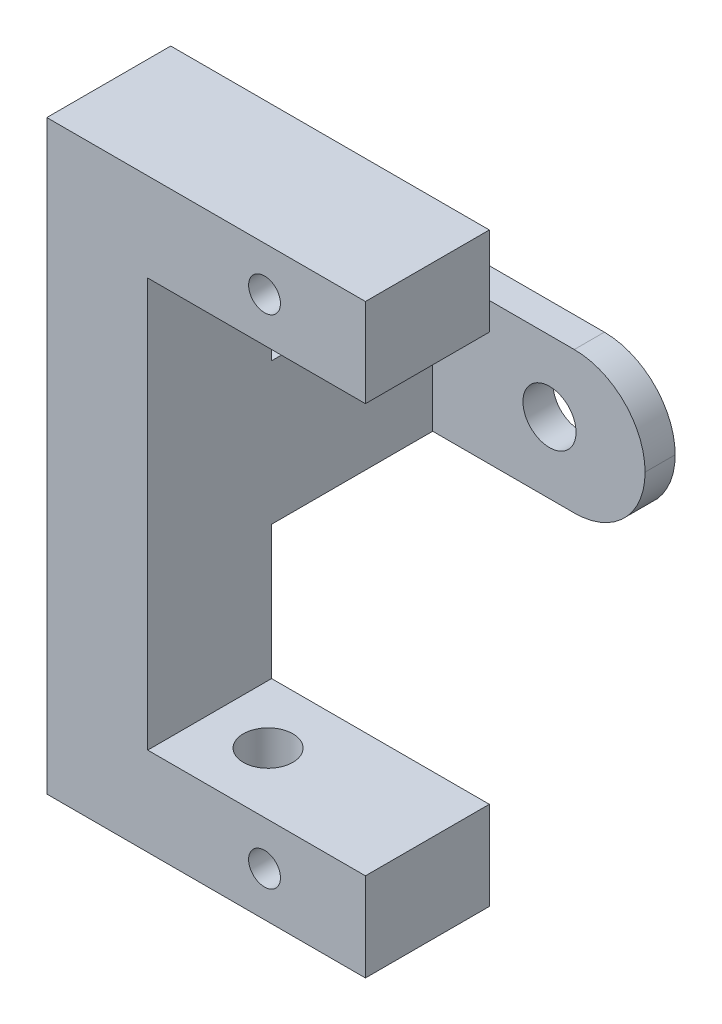
ISO-10303-21;
HEADER;
FILE_DESCRIPTION(('STEP AP214'),'2;1');
FILE_NAME('part.step','',(''),(''),'','','');
FILE_SCHEMA(('AUTOMOTIVE_DESIGN { 1 0 10303 214 1 1 1 1 }'));
ENDSEC;
DATA;
#1=APPLICATION_CONTEXT('core data for automotive mechanical design processes');
#2=APPLICATION_PROTOCOL_DEFINITION('international standard','automotive_design',2000,#1);
#3=PRODUCT_CONTEXT('',#1,'mechanical');
#4=PRODUCT('Part','Part','',(#3));
#5=PRODUCT_RELATED_PRODUCT_CATEGORY('part','',(#4));
#6=PRODUCT_DEFINITION_FORMATION('','',#4);
#7=PRODUCT_DEFINITION_CONTEXT('part definition',#1,'design');
#8=PRODUCT_DEFINITION('design','',#6,#7);
#9=PRODUCT_DEFINITION_SHAPE('','',#8);
#10=(LENGTH_UNIT() NAMED_UNIT(*) SI_UNIT(.MILLI.,.METRE.));
#11=(NAMED_UNIT(*) PLANE_ANGLE_UNIT() SI_UNIT($,.RADIAN.));
#12=(NAMED_UNIT(*) SI_UNIT($,.STERADIAN.) SOLID_ANGLE_UNIT());
#13=UNCERTAINTY_MEASURE_WITH_UNIT(LENGTH_MEASURE(1.E-05),#10,'distance_accuracy_value','');
#14=(GEOMETRIC_REPRESENTATION_CONTEXT(3) GLOBAL_UNCERTAINTY_ASSIGNED_CONTEXT((#13)) GLOBAL_UNIT_ASSIGNED_CONTEXT((#10,
#11,#12)) REPRESENTATION_CONTEXT('',''));
#15=CARTESIAN_POINT('',(0.,0.,0.));
#16=DIRECTION('',(0.,0.,1.));
#17=DIRECTION('',(1.,0.,0.));
#18=AXIS2_PLACEMENT_3D('',#15,#16,#17);
#19=CARTESIAN_POINT('',(-4.,11.55,7.));
#20=DIRECTION('',(-1.,0.,0.));
#21=DIRECTION('',(0.,0.,1.));
#22=AXIS2_PLACEMENT_3D('',#19,#20,#21);
#23=PLANE('',#22);
#24=DIRECTION('',(0.,-1.,0.));
#25=VECTOR('',#24,1.);
#26=CARTESIAN_POINT('',(-4.,4.,-9.1));
#27=LINE('',#26,#25);
#28=CARTESIAN_POINT('',(-4.,4.,-9.1));
#29=VERTEX_POINT('',#28);
#30=CARTESIAN_POINT('',(-4.,-4.,-9.1));
#31=VERTEX_POINT('',#30);
#32=EDGE_CURVE('E143',#29,#31,#27,.T.);
#33=ORIENTED_EDGE('',*,*,#32,.F.);
#34=DIRECTION('',(0.,0.,1.));
#35=VECTOR('',#34,1.);
#36=CARTESIAN_POINT('',(-4.,4.,-10.8));
#37=LINE('',#36,#35);
#38=CARTESIAN_POINT('',(-4.,4.,0.));
#39=VERTEX_POINT('',#38);
#40=EDGE_CURVE('E155',#29,#39,#37,.T.);
#41=ORIENTED_EDGE('',*,*,#40,.T.);
#42=DIRECTION('',(0.,1.,0.));
#43=VECTOR('',#42,1.);
#44=CARTESIAN_POINT('',(-4.,11.55,0.));
#45=LINE('',#44,#43);
#46=CARTESIAN_POINT('',(-4.,11.55,0.));
#47=VERTEX_POINT('',#46);
#48=EDGE_CURVE('E229',#39,#47,#45,.T.);
#49=ORIENTED_EDGE('',*,*,#48,.T.);
#50=DIRECTION('',(0.,0.,-1.));
#51=VECTOR('',#50,1.);
#52=CARTESIAN_POINT('',(-4.,11.55,7.));
#53=LINE('',#52,#51);
#54=CARTESIAN_POINT('',(-4.,11.55,7.));
#55=VERTEX_POINT('',#54);
#56=EDGE_CURVE('E235',#55,#47,#53,.T.);
#57=ORIENTED_EDGE('',*,*,#56,.F.);
#58=DIRECTION('',(0.,1.,0.));
#59=VECTOR('',#58,1.);
#60=CARTESIAN_POINT('',(-4.,11.55,7.));
#61=LINE('',#60,#59);
#62=CARTESIAN_POINT('',(-4.,-11.55,7.));
#63=VERTEX_POINT('',#62);
#64=EDGE_CURVE('E210',#63,#55,#61,.T.);
#65=ORIENTED_EDGE('',*,*,#64,.F.);
#66=DIRECTION('',(0.,0.,-1.));
#67=VECTOR('',#66,1.);
#68=CARTESIAN_POINT('',(-4.,-11.55,7.));
#69=LINE('',#68,#67);
#70=CARTESIAN_POINT('',(-4.,-11.55,0.));
#71=VERTEX_POINT('',#70);
#72=EDGE_CURVE('E238',#63,#71,#69,.T.);
#73=ORIENTED_EDGE('',*,*,#72,.T.);
#74=CARTESIAN_POINT('',(-4.,-4.,0.));
#75=VERTEX_POINT('',#74);
#76=EDGE_CURVE('E230',#71,#75,#45,.T.);
#77=ORIENTED_EDGE('',*,*,#76,.T.);
#78=DIRECTION('',(0.,0.,1.));
#79=VECTOR('',#78,1.);
#80=CARTESIAN_POINT('',(-4.,-4.,-10.8));
#81=LINE('',#80,#79);
#82=EDGE_CURVE('E158',#31,#75,#81,.T.);
#83=ORIENTED_EDGE('',*,*,#82,.F.);
#84=EDGE_LOOP('',(#33,#41,#49,#57,#65,#73,#77,#83));
#85=FACE_BOUND('',#84,.T.);
#86=ADVANCED_FACE('F35',(#85),#23,.F.);
#87=CARTESIAN_POINT('',(0.,0.,0.));
#88=DIRECTION('',(0.,0.,-1.));
#89=DIRECTION('',(-1.,0.,0.));
#90=AXIS2_PLACEMENT_3D('',#87,#88,#89);
#91=PLANE('',#90);
#92=DIRECTION('',(1.,0.,0.));
#93=VECTOR('',#92,1.);
#94=CARTESIAN_POINT('',(-4.,4.,0.));
#95=LINE('',#94,#93);
#96=CARTESIAN_POINT('',(-9.69999999999999,4.,0.));
#97=VERTEX_POINT('',#96);
#98=EDGE_CURVE('E163',#97,#39,#95,.T.);
#99=ORIENTED_EDGE('',*,*,#98,.F.);
#100=DIRECTION('',(0.,-1.,0.));
#101=VECTOR('',#100,1.);
#102=CARTESIAN_POINT('',(-9.69999999999999,-16.55,0.));
#103=LINE('',#102,#101);
#104=CARTESIAN_POINT('',(-9.69999999999999,16.55,0.));
#105=VERTEX_POINT('',#104);
#106=EDGE_CURVE('E220',#105,#97,#103,.T.);
#107=ORIENTED_EDGE('',*,*,#106,.F.);
#108=DIRECTION('',(-1.,0.,0.));
#109=VECTOR('',#108,1.);
#110=CARTESIAN_POINT('',(-9.69999999999999,16.55,0.));
#111=LINE('',#110,#109);
#112=CARTESIAN_POINT('',(8.30000000000001,16.55,0.));
#113=VERTEX_POINT('',#112);
#114=EDGE_CURVE('E217',#113,#105,#111,.T.);
#115=ORIENTED_EDGE('',*,*,#114,.F.);
#116=DIRECTION('',(0.,1.,0.));
#117=VECTOR('',#116,1.);
#118=CARTESIAN_POINT('',(8.30000000000001,16.55,0.));
#119=LINE('',#118,#117);
#120=CARTESIAN_POINT('',(8.3,11.55,0.));
#121=VERTEX_POINT('',#120);
#122=EDGE_CURVE('E187',#121,#113,#119,.T.);
#123=ORIENTED_EDGE('',*,*,#122,.F.);
#124=DIRECTION('',(1.,0.,0.));
#125=VECTOR('',#124,1.);
#126=CARTESIAN_POINT('',(8.3,11.55,0.));
#127=LINE('',#126,#125);
#128=EDGE_CURVE('E200',#47,#121,#127,.T.);
#129=ORIENTED_EDGE('',*,*,#128,.F.);
#130=ORIENTED_EDGE('',*,*,#48,.F.);
#131=EDGE_LOOP('',(#99,#107,#115,#123,#129,#130));
#132=FACE_BOUND('',#131,.T.);
#133=CARTESIAN_POINT('',(2.6,14.05,0.));
#134=DIRECTION('',(0.,0.,1.));
#135=DIRECTION('',(1.,0.,0.));
#136=AXIS2_PLACEMENT_3D('',#133,#134,#135);
#137=CIRCLE('',#136,0.9);
#138=CARTESIAN_POINT('',(3.5,14.05,0.));
#139=VERTEX_POINT('',#138);
#140=EDGE_CURVE('E184',#139,#139,#137,.T.);
#141=ORIENTED_EDGE('',*,*,#140,.T.);
#142=EDGE_LOOP('',(#141));
#143=FACE_BOUND('',#142,.T.);
#144=ADVANCED_FACE('F276',(#132,#143),#91,.T.);
#145=CARTESIAN_POINT('',(8.30000000000001,16.55,7.));
#146=DIRECTION('',(-1.,0.,0.));
#147=DIRECTION('',(0.,-1.,0.));
#148=AXIS2_PLACEMENT_3D('',#145,#146,#147);
#149=PLANE('',#148);
#150=ORIENTED_EDGE('',*,*,#122,.T.);
#151=DIRECTION('',(0.,0.,-1.));
#152=VECTOR('',#151,1.);
#153=CARTESIAN_POINT('',(8.30000000000001,16.55,7.));
#154=LINE('',#153,#152);
#155=CARTESIAN_POINT('',(8.30000000000001,16.55,7.));
#156=VERTEX_POINT('',#155);
#157=EDGE_CURVE('E253',#156,#113,#154,.T.);
#158=ORIENTED_EDGE('',*,*,#157,.F.);
#159=DIRECTION('',(0.,1.,0.));
#160=VECTOR('',#159,1.);
#161=CARTESIAN_POINT('',(8.30000000000001,16.55,7.));
#162=LINE('',#161,#160);
#163=CARTESIAN_POINT('',(8.3,11.55,7.));
#164=VERTEX_POINT('',#163);
#165=EDGE_CURVE('E196',#164,#156,#162,.T.);
#166=ORIENTED_EDGE('',*,*,#165,.F.);
#167=DIRECTION('',(0.,0.,-1.));
#168=VECTOR('',#167,1.);
#169=CARTESIAN_POINT('',(8.3,11.55,7.));
#170=LINE('',#169,#168);
#171=EDGE_CURVE('E214',#164,#121,#170,.T.);
#172=ORIENTED_EDGE('',*,*,#171,.T.);
#173=EDGE_LOOP('',(#150,#158,#166,#172));
#174=FACE_BOUND('',#173,.T.);
#175=ADVANCED_FACE('F311',(#174),#149,.F.);
#176=CARTESIAN_POINT('',(-9.69999999999999,16.55,7.));
#177=DIRECTION('',(0.,-1.,0.));
#178=DIRECTION('',(0.,0.,-1.));
#179=AXIS2_PLACEMENT_3D('',#176,#177,#178);
#180=PLANE('',#179);
#181=ORIENTED_EDGE('',*,*,#114,.T.);
#182=DIRECTION('',(0.,0.,-1.));
#183=VECTOR('',#182,1.);
#184=CARTESIAN_POINT('',(-9.69999999999999,16.55,7.));
#185=LINE('',#184,#183);
#186=CARTESIAN_POINT('',(-9.69999999999999,16.55,7.));
#187=VERTEX_POINT('',#186);
#188=EDGE_CURVE('E250',#187,#105,#185,.T.);
#189=ORIENTED_EDGE('',*,*,#188,.F.);
#190=DIRECTION('',(-1.,0.,0.));
#191=VECTOR('',#190,1.);
#192=CARTESIAN_POINT('',(-9.69999999999999,16.55,7.));
#193=LINE('',#192,#191);
#194=EDGE_CURVE('E199',#156,#187,#193,.T.);
#195=ORIENTED_EDGE('',*,*,#194,.F.);
#196=ORIENTED_EDGE('',*,*,#157,.T.);
#197=EDGE_LOOP('',(#181,#189,#195,#196));
#198=FACE_BOUND('',#197,.T.);
#199=ADVANCED_FACE('F331',(#198),#180,.F.);
#200=CARTESIAN_POINT('',(-9.69999999999999,-16.55,7.));
#201=DIRECTION('',(1.,0.,0.));
#202=DIRECTION('',(0.,0.,-1.));
#203=AXIS2_PLACEMENT_3D('',#200,#201,#202);
#204=PLANE('',#203);
#205=ORIENTED_EDGE('',*,*,#106,.T.);
#206=DIRECTION('',(0.,0.,1.));
#207=VECTOR('',#206,1.);
#208=CARTESIAN_POINT('',(-9.69999999999999,4.,-10.8));
#209=LINE('',#208,#207);
#210=CARTESIAN_POINT('',(-9.69999999999999,4.,-10.8));
#211=VERTEX_POINT('',#210);
#212=EDGE_CURVE('E164',#211,#97,#209,.T.);
#213=ORIENTED_EDGE('',*,*,#212,.F.);
#214=DIRECTION('',(0.,1.,0.));
#215=VECTOR('',#214,1.);
#216=CARTESIAN_POINT('',(-9.69999999999999,4.,-10.8));
#217=LINE('',#216,#215);
#218=CARTESIAN_POINT('',(-9.69999999999999,-4.,-10.8));
#219=VERTEX_POINT('',#218);
#220=EDGE_CURVE('E169',#219,#211,#217,.T.);
#221=ORIENTED_EDGE('',*,*,#220,.F.);
#222=DIRECTION('',(0.,0.,1.));
#223=VECTOR('',#222,1.);
#224=CARTESIAN_POINT('',(-9.69999999999999,-4.,-10.8));
#225=LINE('',#224,#223);
#226=CARTESIAN_POINT('',(-9.69999999999999,-4.,0.));
#227=VERTEX_POINT('',#226);
#228=EDGE_CURVE('E167',#219,#227,#225,.T.);
#229=ORIENTED_EDGE('',*,*,#228,.T.);
#230=CARTESIAN_POINT('',(-9.69999999999999,-16.55,0.));
#231=VERTEX_POINT('',#230);
#232=EDGE_CURVE('E219',#227,#231,#103,.T.);
#233=ORIENTED_EDGE('',*,*,#232,.T.);
#234=DIRECTION('',(0.,0.,-1.));
#235=VECTOR('',#234,1.);
#236=CARTESIAN_POINT('',(-9.69999999999999,-16.55,7.));
#237=LINE('',#236,#235);
#238=CARTESIAN_POINT('',(-9.69999999999999,-16.55,7.));
#239=VERTEX_POINT('',#238);
#240=EDGE_CURVE('E247',#239,#231,#237,.T.);
#241=ORIENTED_EDGE('',*,*,#240,.F.);
#242=DIRECTION('',(0.,-1.,0.));
#243=VECTOR('',#242,1.);
#244=CARTESIAN_POINT('',(-9.69999999999999,-16.55,7.));
#245=LINE('',#244,#243);
#246=EDGE_CURVE('E202',#187,#239,#245,.T.);
#247=ORIENTED_EDGE('',*,*,#246,.F.);
#248=ORIENTED_EDGE('',*,*,#188,.T.);
#249=EDGE_LOOP('',(#205,#213,#221,#229,#233,#241,#247,#248));
#250=FACE_BOUND('',#249,.T.);
#251=ADVANCED_FACE('F271',(#250),#204,.F.);
#252=CARTESIAN_POINT('',(8.30000000000001,-16.55,7.));
#253=DIRECTION('',(0.,1.,0.));
#254=DIRECTION('',(0.,0.,1.));
#255=AXIS2_PLACEMENT_3D('',#252,#253,#254);
#256=PLANE('',#255);
#257=CARTESIAN_POINT('',(-0.699999999999994,-16.55,3.5));
#258=DIRECTION('',(0.,-1.,0.));
#259=DIRECTION('',(0.,0.,-1.));
#260=AXIS2_PLACEMENT_3D('',#257,#258,#259);
#261=CIRCLE('',#260,1.4);
#262=CARTESIAN_POINT('',(-0.699999999999994,-16.55,2.1));
#263=VERTEX_POINT('',#262);
#264=EDGE_CURVE('E177',#263,#263,#261,.T.);
#265=ORIENTED_EDGE('',*,*,#264,.F.);
#266=EDGE_LOOP('',(#265));
#267=FACE_BOUND('',#266,.T.);
#268=DIRECTION('',(1.,0.,0.));
#269=VECTOR('',#268,1.);
#270=CARTESIAN_POINT('',(8.30000000000001,-16.55,0.));
#271=LINE('',#270,#269);
#272=CARTESIAN_POINT('',(8.30000000000001,-16.55,0.));
#273=VERTEX_POINT('',#272);
#274=EDGE_CURVE('E223',#231,#273,#271,.T.);
#275=ORIENTED_EDGE('',*,*,#274,.T.);
#276=DIRECTION('',(0.,0.,-1.));
#277=VECTOR('',#276,1.);
#278=CARTESIAN_POINT('',(8.30000000000001,-16.55,7.));
#279=LINE('',#278,#277);
#280=CARTESIAN_POINT('',(8.30000000000001,-16.55,7.));
#281=VERTEX_POINT('',#280);
#282=EDGE_CURVE('E244',#281,#273,#279,.T.);
#283=ORIENTED_EDGE('',*,*,#282,.F.);
#284=DIRECTION('',(1.,0.,0.));
#285=VECTOR('',#284,1.);
#286=CARTESIAN_POINT('',(8.30000000000001,-16.55,7.));
#287=LINE('',#286,#285);
#288=EDGE_CURVE('E204',#239,#281,#287,.T.);
#289=ORIENTED_EDGE('',*,*,#288,.F.);
#290=ORIENTED_EDGE('',*,*,#240,.T.);
#291=EDGE_LOOP('',(#275,#283,#289,#290));
#292=FACE_BOUND('',#291,.T.);
#293=ADVANCED_FACE('F324',(#267,#292),#256,.F.);
#294=CARTESIAN_POINT('',(8.3,-11.55,7.));
#295=DIRECTION('',(-1.,0.,0.));
#296=DIRECTION('',(0.,-1.,0.));
#297=AXIS2_PLACEMENT_3D('',#294,#295,#296);
#298=PLANE('',#297);
#299=DIRECTION('',(0.,1.,0.));
#300=VECTOR('',#299,1.);
#301=CARTESIAN_POINT('',(8.3,-11.55,0.));
#302=LINE('',#301,#300);
#303=CARTESIAN_POINT('',(8.3,-11.55,0.));
#304=VERTEX_POINT('',#303);
#305=EDGE_CURVE('E225',#273,#304,#302,.T.);
#306=ORIENTED_EDGE('',*,*,#305,.T.);
#307=DIRECTION('',(0.,0.,-1.));
#308=VECTOR('',#307,1.);
#309=CARTESIAN_POINT('',(8.3,-11.55,7.));
#310=LINE('',#309,#308);
#311=CARTESIAN_POINT('',(8.3,-11.55,7.));
#312=VERTEX_POINT('',#311);
#313=EDGE_CURVE('E241',#312,#304,#310,.T.);
#314=ORIENTED_EDGE('',*,*,#313,.F.);
#315=DIRECTION('',(0.,1.,0.));
#316=VECTOR('',#315,1.);
#317=CARTESIAN_POINT('',(8.3,-11.55,7.));
#318=LINE('',#317,#316);
#319=EDGE_CURVE('E206',#281,#312,#318,.T.);
#320=ORIENTED_EDGE('',*,*,#319,.F.);
#321=ORIENTED_EDGE('',*,*,#282,.T.);
#322=EDGE_LOOP('',(#306,#314,#320,#321));
#323=FACE_BOUND('',#322,.T.);
#324=ADVANCED_FACE('F320',(#323),#298,.F.);
#325=CARTESIAN_POINT('',(-4.,-11.55,7.));
#326=DIRECTION('',(0.,-1.,0.));
#327=DIRECTION('',(1.,0.,0.));
#328=AXIS2_PLACEMENT_3D('',#325,#326,#327);
#329=PLANE('',#328);
#330=CARTESIAN_POINT('',(-0.699999999999994,-11.55,3.5));
#331=DIRECTION('',(0.,-1.,0.));
#332=DIRECTION('',(1.,0.,0.));
#333=AXIS2_PLACEMENT_3D('',#330,#331,#332);
#334=CIRCLE('',#333,1.4);
#335=CARTESIAN_POINT('',(0.700000000000006,-11.55,3.5));
#336=VERTEX_POINT('',#335);
#337=EDGE_CURVE('E180',#336,#336,#334,.F.);
#338=ORIENTED_EDGE('',*,*,#337,.F.);
#339=EDGE_LOOP('',(#338));
#340=FACE_BOUND('',#339,.T.);
#341=DIRECTION('',(-1.,0.,0.));
#342=VECTOR('',#341,1.);
#343=CARTESIAN_POINT('',(-4.,-11.55,0.));
#344=LINE('',#343,#342);
#345=EDGE_CURVE('E227',#304,#71,#344,.T.);
#346=ORIENTED_EDGE('',*,*,#345,.T.);
#347=ORIENTED_EDGE('',*,*,#72,.F.);
#348=DIRECTION('',(-1.,0.,0.));
#349=VECTOR('',#348,1.);
#350=CARTESIAN_POINT('',(-4.,-11.55,7.));
#351=LINE('',#350,#349);
#352=EDGE_CURVE('E208',#312,#63,#351,.T.);
#353=ORIENTED_EDGE('',*,*,#352,.F.);
#354=ORIENTED_EDGE('',*,*,#313,.T.);
#355=EDGE_LOOP('',(#346,#347,#353,#354));
#356=FACE_BOUND('',#355,.T.);
#357=ADVANCED_FACE('F317',(#340,#356),#329,.F.);
#358=CARTESIAN_POINT('',(8.3,11.55,7.));
#359=DIRECTION('',(0.,1.,0.));
#360=DIRECTION('',(-1.,0.,0.));
#361=AXIS2_PLACEMENT_3D('',#358,#359,#360);
#362=PLANE('',#361);
#363=ORIENTED_EDGE('',*,*,#128,.T.);
#364=ORIENTED_EDGE('',*,*,#171,.F.);
#365=DIRECTION('',(1.,0.,0.));
#366=VECTOR('',#365,1.);
#367=CARTESIAN_POINT('',(8.3,11.55,7.));
#368=LINE('',#367,#366);
#369=EDGE_CURVE('E212',#55,#164,#368,.T.);
#370=ORIENTED_EDGE('',*,*,#369,.F.);
#371=ORIENTED_EDGE('',*,*,#56,.T.);
#372=EDGE_LOOP('',(#363,#364,#370,#371));
#373=FACE_BOUND('',#372,.T.);
#374=ADVANCED_FACE('F316',(#373),#362,.F.);
#375=CARTESIAN_POINT('',(0.,0.,7.));
#376=DIRECTION('',(0.,0.,-1.));
#377=DIRECTION('',(-1.,0.,0.));
#378=AXIS2_PLACEMENT_3D('',#375,#376,#377);
#379=PLANE('',#378);
#380=CARTESIAN_POINT('',(2.6,14.05,7.));
#381=DIRECTION('',(0.,0.,1.));
#382=DIRECTION('',(1.,0.,0.));
#383=AXIS2_PLACEMENT_3D('',#380,#381,#382);
#384=CIRCLE('',#383,0.9);
#385=CARTESIAN_POINT('',(3.5,14.05,7.));
#386=VERTEX_POINT('',#385);
#387=EDGE_CURVE('E188',#386,#386,#384,.T.);
#388=ORIENTED_EDGE('',*,*,#387,.F.);
#389=EDGE_LOOP('',(#388));
#390=FACE_BOUND('',#389,.T.);
#391=CARTESIAN_POINT('',(2.6,-14.05,7.));
#392=DIRECTION('',(0.,0.,1.));
#393=DIRECTION('',(-1.,0.,0.));
#394=AXIS2_PLACEMENT_3D('',#391,#392,#393);
#395=CIRCLE('',#394,0.9);
#396=CARTESIAN_POINT('',(1.7,-14.05,7.));
#397=VERTEX_POINT('',#396);
#398=EDGE_CURVE('E183',#397,#397,#395,.T.);
#399=ORIENTED_EDGE('',*,*,#398,.F.);
#400=EDGE_LOOP('',(#399));
#401=FACE_BOUND('',#400,.T.);
#402=ORIENTED_EDGE('',*,*,#165,.T.);
#403=ORIENTED_EDGE('',*,*,#194,.T.);
#404=ORIENTED_EDGE('',*,*,#246,.T.);
#405=ORIENTED_EDGE('',*,*,#288,.T.);
#406=ORIENTED_EDGE('',*,*,#319,.T.);
#407=ORIENTED_EDGE('',*,*,#352,.T.);
#408=ORIENTED_EDGE('',*,*,#64,.T.);
#409=ORIENTED_EDGE('',*,*,#369,.T.);
#410=EDGE_LOOP('',(#402,#403,#404,#405,#406,#407,#408,#409));
#411=FACE_BOUND('',#410,.T.);
#412=ADVANCED_FACE('F366',(#390,#401,#411),#379,.F.);
#413=DIRECTION('',(-1.,0.,0.));
#414=VECTOR('',#413,1.);
#415=CARTESIAN_POINT('',(-4.,-4.,0.));
#416=LINE('',#415,#414);
#417=EDGE_CURVE('E151',#75,#227,#416,.T.);
#418=ORIENTED_EDGE('',*,*,#417,.F.);
#419=ORIENTED_EDGE('',*,*,#76,.F.);
#420=ORIENTED_EDGE('',*,*,#345,.F.);
#421=ORIENTED_EDGE('',*,*,#305,.F.);
#422=ORIENTED_EDGE('',*,*,#274,.F.);
#423=ORIENTED_EDGE('',*,*,#232,.F.);
#424=EDGE_LOOP('',(#418,#419,#420,#421,#422,#423));
#425=FACE_BOUND('',#424,.T.);
#426=CARTESIAN_POINT('',(2.6,-14.05,0.));
#427=DIRECTION('',(0.,0.,1.));
#428=DIRECTION('',(-1.,0.,0.));
#429=AXIS2_PLACEMENT_3D('',#426,#427,#428);
#430=CIRCLE('',#429,0.9);
#431=CARTESIAN_POINT('',(1.7,-14.05,0.));
#432=VERTEX_POINT('',#431);
#433=EDGE_CURVE('E191',#432,#432,#430,.T.);
#434=ORIENTED_EDGE('',*,*,#433,.T.);
#435=EDGE_LOOP('',(#434));
#436=FACE_BOUND('',#435,.T.);
#437=ADVANCED_FACE('F313',(#425,#436),#91,.T.);
#438=CARTESIAN_POINT('',(2.6,-14.05,0.));
#439=DIRECTION('',(0.,0.,1.));
#440=DIRECTION('',(1.,0.,0.));
#441=AXIS2_PLACEMENT_3D('',#438,#439,#440);
#442=CYLINDRICAL_SURFACE('',#441,0.9);
#443=ORIENTED_EDGE('',*,*,#433,.F.);
#444=EDGE_LOOP('',(#443));
#445=FACE_BOUND('',#444,.T.);
#446=ORIENTED_EDGE('',*,*,#398,.T.);
#447=EDGE_LOOP('',(#446));
#448=FACE_BOUND('',#447,.T.);
#449=ADVANCED_FACE('F382',(#445,#448),#442,.F.);
#450=CARTESIAN_POINT('',(2.6,14.05,0.));
#451=DIRECTION('',(0.,0.,1.));
#452=DIRECTION('',(1.,0.,0.));
#453=AXIS2_PLACEMENT_3D('',#450,#451,#452);
#454=CYLINDRICAL_SURFACE('',#453,0.9);
#455=ORIENTED_EDGE('',*,*,#140,.F.);
#456=EDGE_LOOP('',(#455));
#457=FACE_BOUND('',#456,.T.);
#458=ORIENTED_EDGE('',*,*,#387,.T.);
#459=EDGE_LOOP('',(#458));
#460=FACE_BOUND('',#459,.T.);
#461=ADVANCED_FACE('F388',(#457,#460),#454,.F.);
#462=CARTESIAN_POINT('',(-0.699999999999994,16.551,3.5));
#463=DIRECTION('',(0.,-1.,0.));
#464=DIRECTION('',(0.,0.,-1.));
#465=AXIS2_PLACEMENT_3D('',#462,#463,#464);
#466=CYLINDRICAL_SURFACE('',#465,1.4);
#467=ORIENTED_EDGE('',*,*,#264,.T.);
#468=EDGE_LOOP('',(#467));
#469=FACE_BOUND('',#468,.T.);
#470=ORIENTED_EDGE('',*,*,#337,.T.);
#471=EDGE_LOOP('',(#470));
#472=FACE_BOUND('',#471,.T.);
#473=ADVANCED_FACE('F392',(#469,#472),#466,.F.);
#474=CARTESIAN_POINT('',(-4.,-4.,-10.8));
#475=DIRECTION('',(0.,1.,0.));
#476=DIRECTION('',(0.,0.,1.));
#477=AXIS2_PLACEMENT_3D('',#474,#475,#476);
#478=PLANE('',#477);
#479=DIRECTION('',(-1.,0.,0.));
#480=VECTOR('',#479,1.);
#481=CARTESIAN_POINT('',(-4.,-4.,-10.8));
#482=LINE('',#481,#480);
#483=CARTESIAN_POINT('',(4.,-4.,-10.8));
#484=VERTEX_POINT('',#483);
#485=EDGE_CURVE('E267',#484,#219,#482,.T.);
#486=ORIENTED_EDGE('',*,*,#485,.F.);
#487=DIRECTION('',(0.,0.,-1.));
#488=VECTOR('',#487,1.);
#489=CARTESIAN_POINT('',(4.,-4.,-10.8));
#490=LINE('',#489,#488);
#491=CARTESIAN_POINT('',(4.,-4.,-9.1));
#492=VERTEX_POINT('',#491);
#493=EDGE_CURVE('E11',#484,#492,#490,.F.);
#494=ORIENTED_EDGE('',*,*,#493,.T.);
#495=DIRECTION('',(-1.,0.,0.));
#496=VECTOR('',#495,1.);
#497=CARTESIAN_POINT('',(8.,-4.,-9.1));
#498=LINE('',#497,#496);
#499=EDGE_CURVE('E152',#492,#31,#498,.T.);
#500=ORIENTED_EDGE('',*,*,#499,.T.);
#501=ORIENTED_EDGE('',*,*,#82,.T.);
#502=ORIENTED_EDGE('',*,*,#417,.T.);
#503=ORIENTED_EDGE('',*,*,#228,.F.);
#504=EDGE_LOOP('',(#486,#494,#500,#501,#502,#503));
#505=FACE_BOUND('',#504,.T.);
#506=ADVANCED_FACE('F304',(#505),#478,.F.);
#507=CARTESIAN_POINT('',(-4.,4.,-10.8));
#508=DIRECTION('',(0.,-1.,0.));
#509=DIRECTION('',(1.,0.,0.));
#510=AXIS2_PLACEMENT_3D('',#507,#508,#509);
#511=PLANE('',#510);
#512=DIRECTION('',(-1.,0.,0.));
#513=VECTOR('',#512,1.);
#514=CARTESIAN_POINT('',(8.,4.,-9.1));
#515=LINE('',#514,#513);
#516=CARTESIAN_POINT('',(4.,4.,-9.1));
#517=VERTEX_POINT('',#516);
#518=EDGE_CURVE('E139',#517,#29,#515,.T.);
#519=ORIENTED_EDGE('',*,*,#518,.F.);
#520=DIRECTION('',(0.,0.,1.));
#521=VECTOR('',#520,1.);
#522=CARTESIAN_POINT('',(4.,3.99999999999999,-10.8));
#523=LINE('',#522,#521);
#524=CARTESIAN_POINT('',(4.,3.99999999999999,-10.8));
#525=VERTEX_POINT('',#524);
#526=EDGE_CURVE('E259',#517,#525,#523,.F.);
#527=ORIENTED_EDGE('',*,*,#526,.T.);
#528=DIRECTION('',(1.,0.,0.));
#529=VECTOR('',#528,1.);
#530=CARTESIAN_POINT('',(-4.,4.,-10.8));
#531=LINE('',#530,#529);
#532=EDGE_CURVE('E165',#211,#525,#531,.T.);
#533=ORIENTED_EDGE('',*,*,#532,.F.);
#534=ORIENTED_EDGE('',*,*,#212,.T.);
#535=ORIENTED_EDGE('',*,*,#98,.T.);
#536=ORIENTED_EDGE('',*,*,#40,.F.);
#537=EDGE_LOOP('',(#519,#527,#533,#534,#535,#536));
#538=FACE_BOUND('',#537,.T.);
#539=ADVANCED_FACE('F161',(#538),#511,.F.);
#540=CARTESIAN_POINT('',(0.,0.,-10.8));
#541=DIRECTION('',(0.,0.,-1.));
#542=DIRECTION('',(-1.,0.,0.));
#543=AXIS2_PLACEMENT_3D('',#540,#541,#542);
#544=PLANE('',#543);
#545=CARTESIAN_POINT('',(2.60000000000001,0.,-10.8));
#546=DIRECTION('',(0.,0.,-1.));
#547=DIRECTION('',(-1.,0.,0.));
#548=AXIS2_PLACEMENT_3D('',#545,#546,#547);
#549=CIRCLE('',#548,1.5);
#550=CARTESIAN_POINT('',(1.10000000000001,0.,-10.8));
#551=VERTEX_POINT('',#550);
#552=EDGE_CURVE('E289',#551,#551,#549,.T.);
#553=ORIENTED_EDGE('',*,*,#552,.F.);
#554=EDGE_LOOP('',(#553));
#555=FACE_BOUND('',#554,.T.);
#556=ORIENTED_EDGE('',*,*,#532,.T.);
#557=CARTESIAN_POINT('',(4.,0.,-10.8));
#558=DIRECTION('',(0.,0.,-1.));
#559=DIRECTION('',(-1.,0.,0.));
#560=AXIS2_PLACEMENT_3D('',#557,#558,#559);
#561=CIRCLE('',#560,4.);
#562=CARTESIAN_POINT('',(8.,0.,-10.8));
#563=VERTEX_POINT('',#562);
#564=EDGE_CURVE('E44',#525,#563,#561,.T.);
#565=ORIENTED_EDGE('',*,*,#564,.T.);
#566=CARTESIAN_POINT('',(4.,0.,-10.8));
#567=DIRECTION('',(0.,0.,-1.));
#568=DIRECTION('',(-1.,0.,0.));
#569=AXIS2_PLACEMENT_3D('',#566,#567,#568);
#570=CIRCLE('',#569,4.);
#571=EDGE_CURVE('E51',#563,#484,#570,.T.);
#572=ORIENTED_EDGE('',*,*,#571,.T.);
#573=ORIENTED_EDGE('',*,*,#485,.T.);
#574=ORIENTED_EDGE('',*,*,#220,.T.);
#575=EDGE_LOOP('',(#556,#565,#572,#573,#574));
#576=FACE_BOUND('',#575,.T.);
#577=ADVANCED_FACE('F264',(#555,#576),#544,.T.);
#578=CARTESIAN_POINT('',(8.,4.,-9.1));
#579=DIRECTION('',(0.,0.,-1.));
#580=DIRECTION('',(0.,1.,0.));
#581=AXIS2_PLACEMENT_3D('',#578,#579,#580);
#582=PLANE('',#581);
#583=CARTESIAN_POINT('',(2.60000000000001,0.,-9.1));
#584=DIRECTION('',(0.,0.,-1.));
#585=DIRECTION('',(0.,1.,0.));
#586=AXIS2_PLACEMENT_3D('',#583,#584,#585);
#587=CIRCLE('',#586,1.5);
#588=CARTESIAN_POINT('',(2.60000000000001,1.5,-9.1));
#589=VERTEX_POINT('',#588);
#590=EDGE_CURVE('E286',#589,#589,#587,.F.);
#591=ORIENTED_EDGE('',*,*,#590,.F.);
#592=EDGE_LOOP('',(#591));
#593=FACE_BOUND('',#592,.T.);
#594=CARTESIAN_POINT('',(4.,0.,-9.1));
#595=DIRECTION('',(0.,0.,-1.));
#596=DIRECTION('',(0.,1.,0.));
#597=AXIS2_PLACEMENT_3D('',#594,#595,#596);
#598=CIRCLE('',#597,4.);
#599=CARTESIAN_POINT('',(8.,0.,-9.1));
#600=VERTEX_POINT('',#599);
#601=EDGE_CURVE('E256',#492,#600,#598,.F.);
#602=ORIENTED_EDGE('',*,*,#601,.T.);
#603=CARTESIAN_POINT('',(4.,0.,-9.1));
#604=DIRECTION('',(0.,0.,-1.));
#605=DIRECTION('',(0.,1.,0.));
#606=AXIS2_PLACEMENT_3D('',#603,#604,#605);
#607=CIRCLE('',#606,4.);
#608=EDGE_CURVE('E146',#600,#517,#607,.F.);
#609=ORIENTED_EDGE('',*,*,#608,.T.);
#610=ORIENTED_EDGE('',*,*,#518,.T.);
#611=ORIENTED_EDGE('',*,*,#32,.T.);
#612=ORIENTED_EDGE('',*,*,#499,.F.);
#613=EDGE_LOOP('',(#602,#609,#610,#611,#612));
#614=FACE_BOUND('',#613,.T.);
#615=ADVANCED_FACE('F141',(#593,#614),#582,.F.);
#616=CARTESIAN_POINT('',(4.,0.,0.));
#617=DIRECTION('',(0.,0.,-1.));
#618=DIRECTION('',(-1.,0.,0.));
#619=AXIS2_PLACEMENT_3D('',#616,#617,#618);
#620=CYLINDRICAL_SURFACE('',#619,4.);
#621=ORIENTED_EDGE('',*,*,#493,.F.);
#622=ORIENTED_EDGE('',*,*,#571,.F.);
#623=DIRECTION('',(0.,0.,-1.));
#624=VECTOR('',#623,1.);
#625=CARTESIAN_POINT('',(8.,0.,0.));
#626=LINE('',#625,#624);
#627=EDGE_CURVE('E39',#600,#563,#626,.T.);
#628=ORIENTED_EDGE('',*,*,#627,.F.);
#629=ORIENTED_EDGE('',*,*,#601,.F.);
#630=EDGE_LOOP('',(#621,#622,#628,#629));
#631=FACE_BOUND('',#630,.T.);
#632=ADVANCED_FACE('F37',(#631),#620,.T.);
#633=CARTESIAN_POINT('',(4.,0.,0.));
#634=DIRECTION('',(0.,0.,1.));
#635=DIRECTION('',(1.,0.,0.));
#636=AXIS2_PLACEMENT_3D('',#633,#634,#635);
#637=CYLINDRICAL_SURFACE('',#636,4.);
#638=ORIENTED_EDGE('',*,*,#564,.F.);
#639=ORIENTED_EDGE('',*,*,#526,.F.);
#640=ORIENTED_EDGE('',*,*,#608,.F.);
#641=ORIENTED_EDGE('',*,*,#627,.T.);
#642=EDGE_LOOP('',(#638,#639,#640,#641));
#643=FACE_BOUND('',#642,.T.);
#644=ADVANCED_FACE('F337',(#643),#637,.T.);
#645=CARTESIAN_POINT('',(2.60000000000001,0.,7.001));
#646=DIRECTION('',(0.,0.,-1.));
#647=DIRECTION('',(-1.,0.,0.));
#648=AXIS2_PLACEMENT_3D('',#645,#646,#647);
#649=CYLINDRICAL_SURFACE('',#648,1.5);
#650=ORIENTED_EDGE('',*,*,#552,.T.);
#651=EDGE_LOOP('',(#650));
#652=FACE_BOUND('',#651,.T.);
#653=ORIENTED_EDGE('',*,*,#590,.T.);
#654=EDGE_LOOP('',(#653));
#655=FACE_BOUND('',#654,.T.);
#656=ADVANCED_FACE('F293',(#652,#655),#649,.F.);
#657=CLOSED_SHELL('',(#86,#144,#175,#199,#251,#293,#324,#357,#374,#412,#437,#449,#461,#473,#506,
#539,#577,#615,#632,#644,#656));
#658=MANIFOLD_SOLID_BREP('B2',#657);
#659=ADVANCED_BREP_SHAPE_REPRESENTATION('',(#18,#658),#14);
#660=SHAPE_DEFINITION_REPRESENTATION(#9,#659);
ENDSEC;
END-ISO-10303-21;
